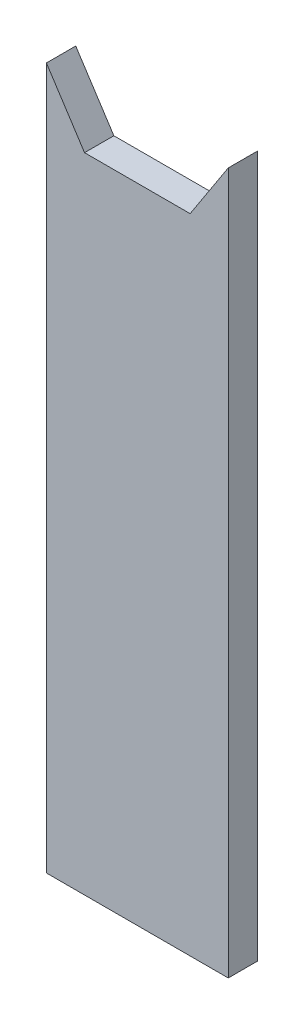
ISO-10303-21;
HEADER;
FILE_DESCRIPTION(('STEP AP214'),'2;1');
FILE_NAME('part.step','',(''),(''),'','','');
FILE_SCHEMA(('AUTOMOTIVE_DESIGN { 1 0 10303 214 1 1 1 1 }'));
ENDSEC;
DATA;
#1=APPLICATION_CONTEXT('core data for automotive mechanical design processes');
#2=APPLICATION_PROTOCOL_DEFINITION('international standard','automotive_design',2000,#1);
#3=PRODUCT_CONTEXT('',#1,'mechanical');
#4=PRODUCT('Part','Part','',(#3));
#5=PRODUCT_RELATED_PRODUCT_CATEGORY('part','',(#4));
#6=PRODUCT_DEFINITION_FORMATION('','',#4);
#7=PRODUCT_DEFINITION_CONTEXT('part definition',#1,'design');
#8=PRODUCT_DEFINITION('design','',#6,#7);
#9=PRODUCT_DEFINITION_SHAPE('','',#8);
#10=(LENGTH_UNIT() NAMED_UNIT(*) SI_UNIT(.MILLI.,.METRE.));
#11=(NAMED_UNIT(*) PLANE_ANGLE_UNIT() SI_UNIT($,.RADIAN.));
#12=(NAMED_UNIT(*) SI_UNIT($,.STERADIAN.) SOLID_ANGLE_UNIT());
#13=UNCERTAINTY_MEASURE_WITH_UNIT(LENGTH_MEASURE(1.E-05),#10,'distance_accuracy_value','');
#14=(GEOMETRIC_REPRESENTATION_CONTEXT(3) GLOBAL_UNCERTAINTY_ASSIGNED_CONTEXT((#13)) GLOBAL_UNIT_ASSIGNED_CONTEXT((#10,
#11,#12)) REPRESENTATION_CONTEXT('',''));
#15=CARTESIAN_POINT('',(0.,0.,0.));
#16=DIRECTION('',(0.,0.,1.));
#17=DIRECTION('',(1.,0.,0.));
#18=AXIS2_PLACEMENT_3D('',#15,#16,#17);
#19=CARTESIAN_POINT('',(15.5,109.404302294077,5.));
#20=DIRECTION('',(0.838443616300637,-0.544988350595415,0.));
#21=DIRECTION('',(0.544988350595415,0.838443616300637,0.));
#22=AXIS2_PLACEMENT_3D('',#19,#20,#21);
#23=PLANE('',#22);
#24=DIRECTION('',(-0.544988350595415,-0.838443616300636,0.));
#25=VECTOR('',#24,1.);
#26=CARTESIAN_POINT('',(15.5,109.404302294077,0.));
#27=LINE('',#26,#25);
#28=CARTESIAN_POINT('',(15.5,109.404302294077,0.));
#29=VERTEX_POINT('',#28);
#30=CARTESIAN_POINT('',(9.,99.4043022940766,0.));
#31=VERTEX_POINT('',#30);
#32=EDGE_CURVE('E128',#29,#31,#27,.T.);
#33=ORIENTED_EDGE('',*,*,#32,.T.);
#34=DIRECTION('',(0.,0.,-1.));
#35=VECTOR('',#34,1.);
#36=CARTESIAN_POINT('',(9.,99.4043022940766,5.));
#37=LINE('',#36,#35);
#38=CARTESIAN_POINT('',(9.,99.4043022940766,5.));
#39=VERTEX_POINT('',#38);
#40=EDGE_CURVE('E11',#39,#31,#37,.T.);
#41=ORIENTED_EDGE('',*,*,#40,.F.);
#42=DIRECTION('',(-0.544988350595415,-0.838443616300636,0.));
#43=VECTOR('',#42,1.);
#44=CARTESIAN_POINT('',(15.5,109.404302294077,5.));
#45=LINE('',#44,#43);
#46=CARTESIAN_POINT('',(15.5,109.404302294077,5.));
#47=VERTEX_POINT('',#46);
#48=EDGE_CURVE('E144',#47,#39,#45,.T.);
#49=ORIENTED_EDGE('',*,*,#48,.F.);
#50=DIRECTION('',(0.,0.,-1.));
#51=VECTOR('',#50,1.);
#52=CARTESIAN_POINT('',(15.5,109.404302294077,5.));
#53=LINE('',#52,#51);
#54=EDGE_CURVE('E124',#47,#29,#53,.T.);
#55=ORIENTED_EDGE('',*,*,#54,.T.);
#56=EDGE_LOOP('',(#33,#41,#49,#55));
#57=FACE_BOUND('',#56,.T.);
#58=ADVANCED_FACE('F39',(#57),#23,.F.);
#59=CARTESIAN_POINT('',(9.,99.4043022940766,5.));
#60=DIRECTION('',(0.,-1.,0.));
#61=DIRECTION('',(0.,0.,-1.));
#62=AXIS2_PLACEMENT_3D('',#59,#60,#61);
#63=PLANE('',#62);
#64=DIRECTION('',(-1.,0.,0.));
#65=VECTOR('',#64,1.);
#66=CARTESIAN_POINT('',(9.,99.4043022940766,0.));
#67=LINE('',#66,#65);
#68=CARTESIAN_POINT('',(-9.,99.4043022940766,0.));
#69=VERTEX_POINT('',#68);
#70=EDGE_CURVE('E132',#31,#69,#67,.T.);
#71=ORIENTED_EDGE('',*,*,#70,.T.);
#72=DIRECTION('',(0.,0.,-1.));
#73=VECTOR('',#72,1.);
#74=CARTESIAN_POINT('',(-9.,99.4043022940766,5.));
#75=LINE('',#74,#73);
#76=CARTESIAN_POINT('',(-9.,99.4043022940766,5.));
#77=VERTEX_POINT('',#76);
#78=EDGE_CURVE('E48',#77,#69,#75,.T.);
#79=ORIENTED_EDGE('',*,*,#78,.F.);
#80=DIRECTION('',(-1.,0.,0.));
#81=VECTOR('',#80,1.);
#82=CARTESIAN_POINT('',(9.,99.4043022940766,5.));
#83=LINE('',#82,#81);
#84=EDGE_CURVE('E93',#39,#77,#83,.T.);
#85=ORIENTED_EDGE('',*,*,#84,.F.);
#86=ORIENTED_EDGE('',*,*,#40,.T.);
#87=EDGE_LOOP('',(#71,#79,#85,#86));
#88=FACE_BOUND('',#87,.T.);
#89=ADVANCED_FACE('F172',(#88),#63,.F.);
#90=CARTESIAN_POINT('',(-15.5,109.404302294077,5.));
#91=DIRECTION('',(-0.838443616300637,-0.544988350595415,0.));
#92=DIRECTION('',(0.544988350595415,-0.838443616300637,0.));
#93=AXIS2_PLACEMENT_3D('',#90,#91,#92);
#94=PLANE('',#93);
#95=DIRECTION('',(-0.544988350595415,0.838443616300636,0.));
#96=VECTOR('',#95,1.);
#97=CARTESIAN_POINT('',(-15.5,109.404302294077,0.));
#98=LINE('',#97,#96);
#99=CARTESIAN_POINT('',(-15.5,109.404302294077,0.));
#100=VERTEX_POINT('',#99);
#101=EDGE_CURVE('E135',#69,#100,#98,.T.);
#102=ORIENTED_EDGE('',*,*,#101,.T.);
#103=DIRECTION('',(0.,0.,-1.));
#104=VECTOR('',#103,1.);
#105=CARTESIAN_POINT('',(-15.5,109.404302294077,5.));
#106=LINE('',#105,#104);
#107=CARTESIAN_POINT('',(-15.5,109.404302294077,5.));
#108=VERTEX_POINT('',#107);
#109=EDGE_CURVE('E117',#108,#100,#106,.T.);
#110=ORIENTED_EDGE('',*,*,#109,.F.);
#111=DIRECTION('',(-0.544988350595415,0.838443616300636,0.));
#112=VECTOR('',#111,1.);
#113=CARTESIAN_POINT('',(-15.5,109.404302294077,5.));
#114=LINE('',#113,#112);
#115=EDGE_CURVE('E106',#77,#108,#114,.T.);
#116=ORIENTED_EDGE('',*,*,#115,.F.);
#117=ORIENTED_EDGE('',*,*,#78,.T.);
#118=EDGE_LOOP('',(#102,#110,#116,#117));
#119=FACE_BOUND('',#118,.T.);
#120=ADVANCED_FACE('F154',(#119),#94,.F.);
#121=CARTESIAN_POINT('',(-15.5,109.404302294077,5.));
#122=DIRECTION('',(1.,0.,0.));
#123=DIRECTION('',(0.,1.,0.));
#124=AXIS2_PLACEMENT_3D('',#121,#122,#123);
#125=PLANE('',#124);
#126=DIRECTION('',(0.,-1.,0.));
#127=VECTOR('',#126,1.);
#128=CARTESIAN_POINT('',(-15.5,109.404302294077,0.));
#129=LINE('',#128,#127);
#130=CARTESIAN_POINT('',(-15.5,-10.1956977059234,0.));
#131=VERTEX_POINT('',#130);
#132=EDGE_CURVE('E115',#100,#131,#129,.T.);
#133=ORIENTED_EDGE('',*,*,#132,.T.);
#134=DIRECTION('',(0.,0.,-1.));
#135=VECTOR('',#134,1.);
#136=CARTESIAN_POINT('',(-15.5,-10.1956977059234,5.));
#137=LINE('',#136,#135);
#138=CARTESIAN_POINT('',(-15.5,-10.1956977059234,5.));
#139=VERTEX_POINT('',#138);
#140=EDGE_CURVE('E112',#139,#131,#137,.T.);
#141=ORIENTED_EDGE('',*,*,#140,.F.);
#142=DIRECTION('',(0.,-1.,0.));
#143=VECTOR('',#142,1.);
#144=CARTESIAN_POINT('',(-15.5,109.404302294077,5.));
#145=LINE('',#144,#143);
#146=EDGE_CURVE('E100',#108,#139,#145,.T.);
#147=ORIENTED_EDGE('',*,*,#146,.F.);
#148=ORIENTED_EDGE('',*,*,#109,.T.);
#149=EDGE_LOOP('',(#133,#141,#147,#148));
#150=FACE_BOUND('',#149,.T.);
#151=ADVANCED_FACE('F113',(#150),#125,.F.);
#152=CARTESIAN_POINT('',(15.5,-10.1956977059234,5.));
#153=DIRECTION('',(0.,1.,0.));
#154=DIRECTION('',(0.,0.,1.));
#155=AXIS2_PLACEMENT_3D('',#152,#153,#154);
#156=PLANE('',#155);
#157=DIRECTION('',(1.,0.,0.));
#158=VECTOR('',#157,1.);
#159=CARTESIAN_POINT('',(15.5,-10.1956977059234,0.));
#160=LINE('',#159,#158);
#161=CARTESIAN_POINT('',(15.5,-10.1956977059234,0.));
#162=VERTEX_POINT('',#161);
#163=EDGE_CURVE('E79',#131,#162,#160,.T.);
#164=ORIENTED_EDGE('',*,*,#163,.T.);
#165=DIRECTION('',(0.,0.,-1.));
#166=VECTOR('',#165,1.);
#167=CARTESIAN_POINT('',(15.5,-10.1956977059234,5.));
#168=LINE('',#167,#166);
#169=CARTESIAN_POINT('',(15.5,-10.1956977059234,5.));
#170=VERTEX_POINT('',#169);
#171=EDGE_CURVE('E118',#170,#162,#168,.T.);
#172=ORIENTED_EDGE('',*,*,#171,.F.);
#173=DIRECTION('',(1.,0.,0.));
#174=VECTOR('',#173,1.);
#175=CARTESIAN_POINT('',(15.5,-10.1956977059234,5.));
#176=LINE('',#175,#174);
#177=EDGE_CURVE('E104',#139,#170,#176,.T.);
#178=ORIENTED_EDGE('',*,*,#177,.F.);
#179=ORIENTED_EDGE('',*,*,#140,.T.);
#180=EDGE_LOOP('',(#164,#172,#178,#179));
#181=FACE_BOUND('',#180,.T.);
#182=ADVANCED_FACE('F120',(#181),#156,.F.);
#183=CARTESIAN_POINT('',(15.5,109.404302294077,5.));
#184=DIRECTION('',(-1.,0.,0.));
#185=DIRECTION('',(0.,-1.,0.));
#186=AXIS2_PLACEMENT_3D('',#183,#184,#185);
#187=PLANE('',#186);
#188=DIRECTION('',(0.,1.,0.));
#189=VECTOR('',#188,1.);
#190=CARTESIAN_POINT('',(15.5,109.404302294077,0.));
#191=LINE('',#190,#189);
#192=EDGE_CURVE('E85',#162,#29,#191,.T.);
#193=ORIENTED_EDGE('',*,*,#192,.T.);
#194=ORIENTED_EDGE('',*,*,#54,.F.);
#195=DIRECTION('',(0.,1.,0.));
#196=VECTOR('',#195,1.);
#197=CARTESIAN_POINT('',(15.5,109.404302294077,5.));
#198=LINE('',#197,#196);
#199=EDGE_CURVE('E56',#170,#47,#198,.T.);
#200=ORIENTED_EDGE('',*,*,#199,.F.);
#201=ORIENTED_EDGE('',*,*,#171,.T.);
#202=EDGE_LOOP('',(#193,#194,#200,#201));
#203=FACE_BOUND('',#202,.T.);
#204=ADVANCED_FACE('F161',(#203),#187,.F.);
#205=CARTESIAN_POINT('',(0.,0.,5.));
#206=DIRECTION('',(0.,0.,1.));
#207=DIRECTION('',(1.,0.,0.));
#208=AXIS2_PLACEMENT_3D('',#205,#206,#207);
#209=PLANE('',#208);
#210=ORIENTED_EDGE('',*,*,#48,.T.);
#211=ORIENTED_EDGE('',*,*,#84,.T.);
#212=ORIENTED_EDGE('',*,*,#115,.T.);
#213=ORIENTED_EDGE('',*,*,#146,.T.);
#214=ORIENTED_EDGE('',*,*,#177,.T.);
#215=ORIENTED_EDGE('',*,*,#199,.T.);
#216=EDGE_LOOP('',(#210,#211,#212,#213,#214,#215));
#217=FACE_BOUND('',#216,.T.);
#218=ADVANCED_FACE('F102',(#217),#209,.T.);
#219=CARTESIAN_POINT('',(0.,0.,0.));
#220=DIRECTION('',(0.,0.,1.));
#221=DIRECTION('',(1.,0.,0.));
#222=AXIS2_PLACEMENT_3D('',#219,#220,#221);
#223=PLANE('',#222);
#224=ORIENTED_EDGE('',*,*,#32,.F.);
#225=ORIENTED_EDGE('',*,*,#192,.F.);
#226=ORIENTED_EDGE('',*,*,#163,.F.);
#227=ORIENTED_EDGE('',*,*,#132,.F.);
#228=ORIENTED_EDGE('',*,*,#101,.F.);
#229=ORIENTED_EDGE('',*,*,#70,.F.);
#230=EDGE_LOOP('',(#224,#225,#226,#227,#228,#229));
#231=FACE_BOUND('',#230,.T.);
#232=ADVANCED_FACE('F157',(#231),#223,.F.);
#233=CLOSED_SHELL('',(#58,#89,#120,#151,#182,#204,#218,#232));
#234=MANIFOLD_SOLID_BREP('B2',#233);
#235=ADVANCED_BREP_SHAPE_REPRESENTATION('',(#18,#234),#14);
#236=SHAPE_DEFINITION_REPRESENTATION(#9,#235);
ENDSEC;
END-ISO-10303-21;
